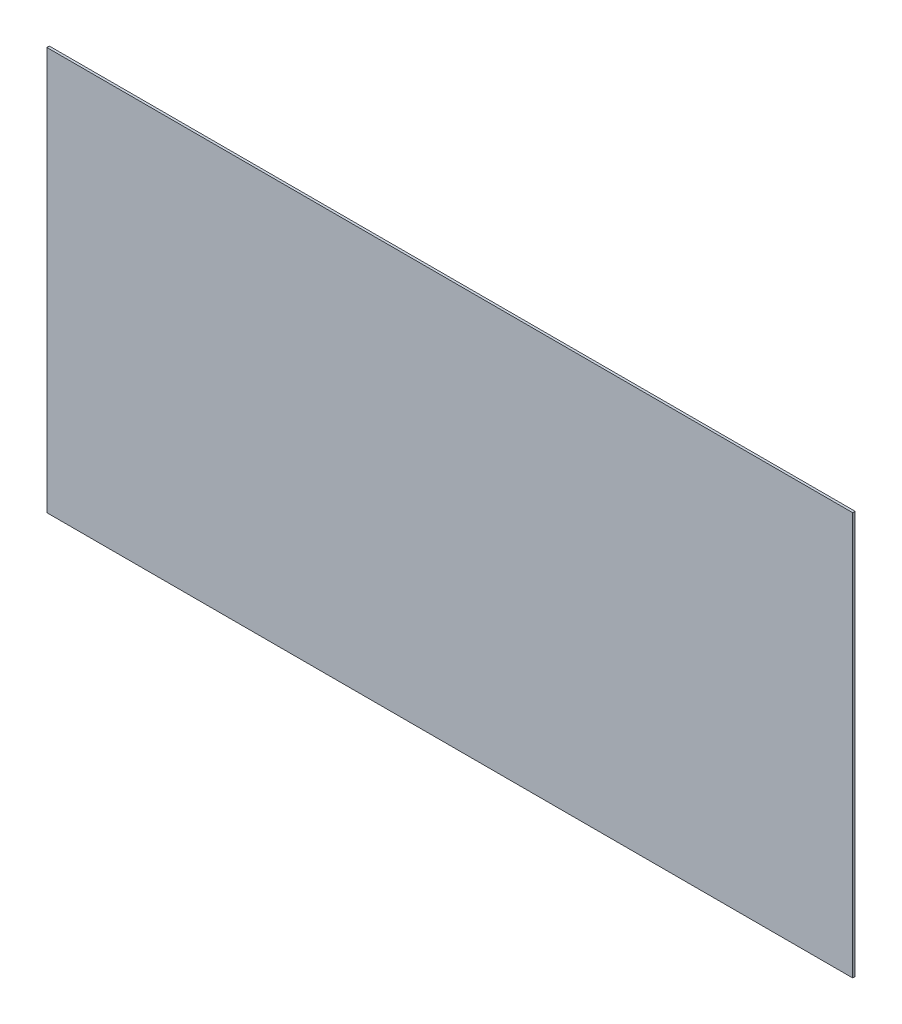
ISO-10303-21;
HEADER;
FILE_DESCRIPTION(('STEP AP214'),'2;1');
FILE_NAME('part.step','',(''),(''),'','','');
FILE_SCHEMA(('AUTOMOTIVE_DESIGN { 1 0 10303 214 1 1 1 1 }'));
ENDSEC;
DATA;
#1=APPLICATION_CONTEXT('core data for automotive mechanical design processes');
#2=APPLICATION_PROTOCOL_DEFINITION('international standard','automotive_design',2000,#1);
#3=PRODUCT_CONTEXT('',#1,'mechanical');
#4=PRODUCT('Part','Part','',(#3));
#5=PRODUCT_RELATED_PRODUCT_CATEGORY('part','',(#4));
#6=PRODUCT_DEFINITION_FORMATION('','',#4);
#7=PRODUCT_DEFINITION_CONTEXT('part definition',#1,'design');
#8=PRODUCT_DEFINITION('design','',#6,#7);
#9=PRODUCT_DEFINITION_SHAPE('','',#8);
#10=(LENGTH_UNIT() NAMED_UNIT(*) SI_UNIT(.MILLI.,.METRE.));
#11=(NAMED_UNIT(*) PLANE_ANGLE_UNIT() SI_UNIT($,.RADIAN.));
#12=(NAMED_UNIT(*) SI_UNIT($,.STERADIAN.) SOLID_ANGLE_UNIT());
#13=UNCERTAINTY_MEASURE_WITH_UNIT(LENGTH_MEASURE(1.E-05),#10,'distance_accuracy_value','');
#14=(GEOMETRIC_REPRESENTATION_CONTEXT(3) GLOBAL_UNCERTAINTY_ASSIGNED_CONTEXT((#13)) GLOBAL_UNIT_ASSIGNED_CONTEXT((#10,
#11,#12)) REPRESENTATION_CONTEXT('',''));
#15=CARTESIAN_POINT('',(0.,0.,0.));
#16=DIRECTION('',(0.,0.,1.));
#17=DIRECTION('',(1.,0.,0.));
#18=AXIS2_PLACEMENT_3D('',#15,#16,#17);
#19=CARTESIAN_POINT('',(914.4,-457.2,5.588));
#20=DIRECTION('',(-1.,0.,0.));
#21=DIRECTION('',(0.,0.,1.));
#22=AXIS2_PLACEMENT_3D('',#19,#20,#21);
#23=PLANE('',#22);
#24=DIRECTION('',(0.,1.,0.));
#25=VECTOR('',#24,1.);
#26=CARTESIAN_POINT('',(914.4,-457.2,0.));
#27=LINE('',#26,#25);
#28=CARTESIAN_POINT('',(914.4,-457.2,0.));
#29=VERTEX_POINT('',#28);
#30=CARTESIAN_POINT('',(914.4,457.2,0.));
#31=VERTEX_POINT('',#30);
#32=EDGE_CURVE('E96',#29,#31,#27,.T.);
#33=ORIENTED_EDGE('',*,*,#32,.T.);
#34=DIRECTION('',(0.,0.,-1.));
#35=VECTOR('',#34,1.);
#36=CARTESIAN_POINT('',(914.4,457.2,5.588));
#37=LINE('',#36,#35);
#38=CARTESIAN_POINT('',(914.4,457.2,5.588));
#39=VERTEX_POINT('',#38);
#40=EDGE_CURVE('E11',#39,#31,#37,.T.);
#41=ORIENTED_EDGE('',*,*,#40,.F.);
#42=DIRECTION('',(0.,1.,0.));
#43=VECTOR('',#42,1.);
#44=CARTESIAN_POINT('',(914.4,-457.2,5.588));
#45=LINE('',#44,#43);
#46=CARTESIAN_POINT('',(914.4,-457.2,5.588));
#47=VERTEX_POINT('',#46);
#48=EDGE_CURVE('E84',#47,#39,#45,.T.);
#49=ORIENTED_EDGE('',*,*,#48,.F.);
#50=DIRECTION('',(0.,0.,-1.));
#51=VECTOR('',#50,1.);
#52=CARTESIAN_POINT('',(914.4,-457.2,5.588));
#53=LINE('',#52,#51);
#54=EDGE_CURVE('E92',#47,#29,#53,.T.);
#55=ORIENTED_EDGE('',*,*,#54,.T.);
#56=EDGE_LOOP('',(#33,#41,#49,#55));
#57=FACE_BOUND('',#56,.T.);
#58=ADVANCED_FACE('F33',(#57),#23,.F.);
#59=CARTESIAN_POINT('',(-914.4,457.2,5.588));
#60=DIRECTION('',(0.,-1.,0.));
#61=DIRECTION('',(0.,0.,-1.));
#62=AXIS2_PLACEMENT_3D('',#59,#60,#61);
#63=PLANE('',#62);
#64=DIRECTION('',(-1.,0.,0.));
#65=VECTOR('',#64,1.);
#66=CARTESIAN_POINT('',(-914.4,457.2,0.));
#67=LINE('',#66,#65);
#68=CARTESIAN_POINT('',(-914.4,457.2,0.));
#69=VERTEX_POINT('',#68);
#70=EDGE_CURVE('E88',#31,#69,#67,.T.);
#71=ORIENTED_EDGE('',*,*,#70,.T.);
#72=DIRECTION('',(0.,0.,-1.));
#73=VECTOR('',#72,1.);
#74=CARTESIAN_POINT('',(-914.4,457.2,5.588));
#75=LINE('',#74,#73);
#76=CARTESIAN_POINT('',(-914.4,457.2,5.588));
#77=VERTEX_POINT('',#76);
#78=EDGE_CURVE('E41',#77,#69,#75,.T.);
#79=ORIENTED_EDGE('',*,*,#78,.F.);
#80=DIRECTION('',(-1.,0.,0.));
#81=VECTOR('',#80,1.);
#82=CARTESIAN_POINT('',(-914.4,457.2,5.588));
#83=LINE('',#82,#81);
#84=EDGE_CURVE('E79',#39,#77,#83,.T.);
#85=ORIENTED_EDGE('',*,*,#84,.F.);
#86=ORIENTED_EDGE('',*,*,#40,.T.);
#87=EDGE_LOOP('',(#71,#79,#85,#86));
#88=FACE_BOUND('',#87,.T.);
#89=ADVANCED_FACE('F87',(#88),#63,.F.);
#90=CARTESIAN_POINT('',(-914.4,-457.2,5.588));
#91=DIRECTION('',(1.,0.,0.));
#92=DIRECTION('',(0.,0.,-1.));
#93=AXIS2_PLACEMENT_3D('',#90,#91,#92);
#94=PLANE('',#93);
#95=DIRECTION('',(0.,-1.,0.));
#96=VECTOR('',#95,1.);
#97=CARTESIAN_POINT('',(-914.4,-457.2,0.));
#98=LINE('',#97,#96);
#99=CARTESIAN_POINT('',(-914.4,-457.2,0.));
#100=VERTEX_POINT('',#99);
#101=EDGE_CURVE('E66',#69,#100,#98,.T.);
#102=ORIENTED_EDGE('',*,*,#101,.T.);
#103=DIRECTION('',(0.,0.,-1.));
#104=VECTOR('',#103,1.);
#105=CARTESIAN_POINT('',(-914.4,-457.2,5.588));
#106=LINE('',#105,#104);
#107=CARTESIAN_POINT('',(-914.4,-457.2,5.588));
#108=VERTEX_POINT('',#107);
#109=EDGE_CURVE('E89',#108,#100,#106,.T.);
#110=ORIENTED_EDGE('',*,*,#109,.F.);
#111=DIRECTION('',(0.,-1.,0.));
#112=VECTOR('',#111,1.);
#113=CARTESIAN_POINT('',(-914.4,-457.2,5.588));
#114=LINE('',#113,#112);
#115=EDGE_CURVE('E82',#77,#108,#114,.T.);
#116=ORIENTED_EDGE('',*,*,#115,.F.);
#117=ORIENTED_EDGE('',*,*,#78,.T.);
#118=EDGE_LOOP('',(#102,#110,#116,#117));
#119=FACE_BOUND('',#118,.T.);
#120=ADVANCED_FACE('F90',(#119),#94,.F.);
#121=CARTESIAN_POINT('',(-914.4,-457.2,5.588));
#122=DIRECTION('',(0.,1.,0.));
#123=DIRECTION('',(0.,0.,1.));
#124=AXIS2_PLACEMENT_3D('',#121,#122,#123);
#125=PLANE('',#124);
#126=DIRECTION('',(1.,0.,0.));
#127=VECTOR('',#126,1.);
#128=CARTESIAN_POINT('',(-914.4,-457.2,0.));
#129=LINE('',#128,#127);
#130=EDGE_CURVE('E72',#100,#29,#129,.T.);
#131=ORIENTED_EDGE('',*,*,#130,.T.);
#132=ORIENTED_EDGE('',*,*,#54,.F.);
#133=DIRECTION('',(1.,0.,0.));
#134=VECTOR('',#133,1.);
#135=CARTESIAN_POINT('',(-914.4,-457.2,5.588));
#136=LINE('',#135,#134);
#137=EDGE_CURVE('E49',#108,#47,#136,.T.);
#138=ORIENTED_EDGE('',*,*,#137,.F.);
#139=ORIENTED_EDGE('',*,*,#109,.T.);
#140=EDGE_LOOP('',(#131,#132,#138,#139));
#141=FACE_BOUND('',#140,.T.);
#142=ADVANCED_FACE('F103',(#141),#125,.F.);
#143=CARTESIAN_POINT('',(0.,0.,5.588));
#144=DIRECTION('',(0.,0.,-1.));
#145=DIRECTION('',(-1.,0.,0.));
#146=AXIS2_PLACEMENT_3D('',#143,#144,#145);
#147=PLANE('',#146);
#148=ORIENTED_EDGE('',*,*,#48,.T.);
#149=ORIENTED_EDGE('',*,*,#84,.T.);
#150=ORIENTED_EDGE('',*,*,#115,.T.);
#151=ORIENTED_EDGE('',*,*,#137,.T.);
#152=EDGE_LOOP('',(#148,#149,#150,#151));
#153=FACE_BOUND('',#152,.T.);
#154=ADVANCED_FACE('F80',(#153),#147,.F.);
#155=CARTESIAN_POINT('',(0.,0.,0.));
#156=DIRECTION('',(0.,0.,-1.));
#157=DIRECTION('',(-1.,0.,0.));
#158=AXIS2_PLACEMENT_3D('',#155,#156,#157);
#159=PLANE('',#158);
#160=ORIENTED_EDGE('',*,*,#32,.F.);
#161=ORIENTED_EDGE('',*,*,#130,.F.);
#162=ORIENTED_EDGE('',*,*,#101,.F.);
#163=ORIENTED_EDGE('',*,*,#70,.F.);
#164=EDGE_LOOP('',(#160,#161,#162,#163));
#165=FACE_BOUND('',#164,.T.);
#166=ADVANCED_FACE('F106',(#165),#159,.T.);
#167=CLOSED_SHELL('',(#58,#89,#120,#142,#154,#166));
#168=MANIFOLD_SOLID_BREP('B2',#167);
#169=ADVANCED_BREP_SHAPE_REPRESENTATION('',(#18,#168),#14);
#170=SHAPE_DEFINITION_REPRESENTATION(#9,#169);
ENDSEC;
END-ISO-10303-21;
